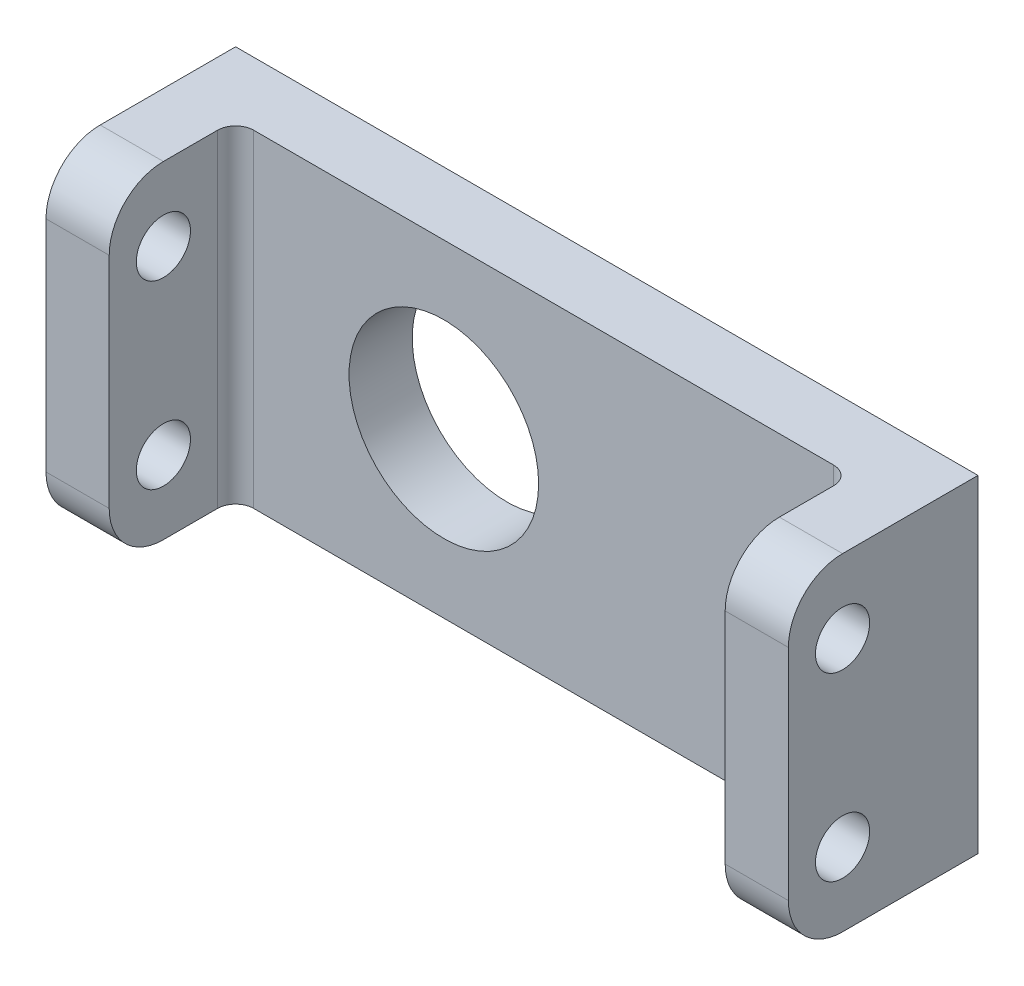
ISO-10303-21;
HEADER;
FILE_DESCRIPTION(('STEP AP214'),'2;1');
FILE_NAME('part.step','',(''),(''),'','','');
FILE_SCHEMA(('AUTOMOTIVE_DESIGN { 1 0 10303 214 1 1 1 1 }'));
ENDSEC;
DATA;
#1=APPLICATION_CONTEXT('core data for automotive mechanical design processes');
#2=APPLICATION_PROTOCOL_DEFINITION('international standard','automotive_design',2000,#1);
#3=PRODUCT_CONTEXT('',#1,'mechanical');
#4=PRODUCT('Part','Part','',(#3));
#5=PRODUCT_RELATED_PRODUCT_CATEGORY('part','',(#4));
#6=PRODUCT_DEFINITION_FORMATION('','',#4);
#7=PRODUCT_DEFINITION_CONTEXT('part definition',#1,'design');
#8=PRODUCT_DEFINITION('design','',#6,#7);
#9=PRODUCT_DEFINITION_SHAPE('','',#8);
#10=(LENGTH_UNIT() NAMED_UNIT(*) SI_UNIT(.MILLI.,.METRE.));
#11=(NAMED_UNIT(*) PLANE_ANGLE_UNIT() SI_UNIT($,.RADIAN.));
#12=(NAMED_UNIT(*) SI_UNIT($,.STERADIAN.) SOLID_ANGLE_UNIT());
#13=UNCERTAINTY_MEASURE_WITH_UNIT(LENGTH_MEASURE(1.E-05),#10,'distance_accuracy_value','');
#14=(GEOMETRIC_REPRESENTATION_CONTEXT(3) GLOBAL_UNCERTAINTY_ASSIGNED_CONTEXT((#13)) GLOBAL_UNIT_ASSIGNED_CONTEXT((#10,
#11,#12)) REPRESENTATION_CONTEXT('',''));
#15=CARTESIAN_POINT('',(0.,0.,0.));
#16=DIRECTION('',(0.,0.,1.));
#17=DIRECTION('',(1.,0.,0.));
#18=AXIS2_PLACEMENT_3D('',#15,#16,#17);
#19=CARTESIAN_POINT('',(0.,0.,3.5));
#20=DIRECTION('',(0.,0.,-1.));
#21=DIRECTION('',(-1.,0.,0.));
#22=AXIS2_PLACEMENT_3D('',#19,#20,#21);
#23=PLANE('',#22);
#24=CARTESIAN_POINT('',(-17.4839597508269,-3.012876727069,3.5));
#25=DIRECTION('',(0.,0.,1.));
#26=DIRECTION('',(1.,0.,0.));
#27=AXIS2_PLACEMENT_3D('',#24,#25,#26);
#28=CIRCLE('',#27,5.25);
#29=CARTESIAN_POINT('',(-12.2339597508269,-3.012876727069,3.5));
#30=VERTEX_POINT('',#29);
#31=EDGE_CURVE('E163',#30,#30,#28,.T.);
#32=ORIENTED_EDGE('',*,*,#31,.F.);
#33=EDGE_LOOP('',(#32));
#34=FACE_BOUND('',#33,.T.);
#35=DIRECTION('',(-1.,0.,0.));
#36=VECTOR('',#35,1.);
#37=CARTESIAN_POINT('',(8.5960402491731,6.057123272931,3.5));
#38=LINE('',#37,#36);
#39=CARTESIAN_POINT('',(4.0960402491731,6.057123272931,3.5));
#40=VERTEX_POINT('',#39);
#41=CARTESIAN_POINT('',(-28.0139597508269,6.05712327293099,3.5));
#42=VERTEX_POINT('',#41);
#43=EDGE_CURVE('E175',#40,#42,#38,.T.);
#44=ORIENTED_EDGE('',*,*,#43,.T.);
#45=DIRECTION('',(0.,1.,0.));
#46=VECTOR('',#45,1.);
#47=CARTESIAN_POINT('',(-28.0139597508269,-12.082876727069,3.5));
#48=LINE('',#47,#46);
#49=CARTESIAN_POINT('',(-28.0139597508269,-12.082876727069,3.5));
#50=VERTEX_POINT('',#49);
#51=EDGE_CURVE('E194',#42,#50,#48,.F.);
#52=ORIENTED_EDGE('',*,*,#51,.T.);
#53=DIRECTION('',(1.,0.,0.));
#54=VECTOR('',#53,1.);
#55=CARTESIAN_POINT('',(8.59604024917311,-12.082876727069,3.5));
#56=LINE('',#55,#54);
#57=CARTESIAN_POINT('',(4.0960402491731,-12.082876727069,3.5));
#58=VERTEX_POINT('',#57);
#59=EDGE_CURVE('E169',#50,#58,#56,.T.);
#60=ORIENTED_EDGE('',*,*,#59,.T.);
#61=DIRECTION('',(0.,-1.,0.));
#62=VECTOR('',#61,1.);
#63=CARTESIAN_POINT('',(4.0960402491731,6.057123272931,3.5));
#64=LINE('',#63,#62);
#65=EDGE_CURVE('E192',#58,#40,#64,.F.);
#66=ORIENTED_EDGE('',*,*,#65,.T.);
#67=EDGE_LOOP('',(#44,#52,#60,#66));
#68=FACE_BOUND('',#67,.T.);
#69=ADVANCED_FACE('F33',(#34,#68),#23,.F.);
#70=CARTESIAN_POINT('',(0.,0.,0.));
#71=DIRECTION('',(0.,0.,-1.));
#72=DIRECTION('',(-1.,0.,0.));
#73=AXIS2_PLACEMENT_3D('',#70,#71,#72);
#74=PLANE('',#73);
#75=DIRECTION('',(0.,1.,0.));
#76=VECTOR('',#75,1.);
#77=CARTESIAN_POINT('',(8.5960402491731,6.057123272931,0.));
#78=LINE('',#77,#76);
#79=CARTESIAN_POINT('',(8.59604024917311,-12.082876727069,0.));
#80=VERTEX_POINT('',#79);
#81=CARTESIAN_POINT('',(8.5960402491731,6.057123272931,0.));
#82=VERTEX_POINT('',#81);
#83=EDGE_CURVE('E155',#80,#82,#78,.T.);
#84=ORIENTED_EDGE('',*,*,#83,.F.);
#85=DIRECTION('',(1.,0.,0.));
#86=VECTOR('',#85,1.);
#87=CARTESIAN_POINT('',(8.59604024917311,-12.082876727069,0.));
#88=LINE('',#87,#86);
#89=CARTESIAN_POINT('',(-32.5139597508269,-12.082876727069,0.));
#90=VERTEX_POINT('',#89);
#91=EDGE_CURVE('E173',#90,#80,#88,.T.);
#92=ORIENTED_EDGE('',*,*,#91,.F.);
#93=DIRECTION('',(0.,-1.,0.));
#94=VECTOR('',#93,1.);
#95=CARTESIAN_POINT('',(-32.5139597508269,6.05712327293099,0.));
#96=LINE('',#95,#94);
#97=CARTESIAN_POINT('',(-32.5139597508269,6.05712327293099,0.));
#98=VERTEX_POINT('',#97);
#99=EDGE_CURVE('E157',#98,#90,#96,.T.);
#100=ORIENTED_EDGE('',*,*,#99,.F.);
#101=DIRECTION('',(-1.,0.,0.));
#102=VECTOR('',#101,1.);
#103=CARTESIAN_POINT('',(8.5960402491731,6.057123272931,0.));
#104=LINE('',#103,#102);
#105=EDGE_CURVE('E140',#82,#98,#104,.T.);
#106=ORIENTED_EDGE('',*,*,#105,.F.);
#107=EDGE_LOOP('',(#84,#92,#100,#106));
#108=FACE_BOUND('',#107,.T.);
#109=CARTESIAN_POINT('',(-17.4839597508269,-3.012876727069,0.));
#110=DIRECTION('',(0.,0.,1.));
#111=DIRECTION('',(1.,0.,0.));
#112=AXIS2_PLACEMENT_3D('',#109,#110,#111);
#113=CIRCLE('',#112,5.25);
#114=CARTESIAN_POINT('',(-12.2339597508269,-3.012876727069,0.));
#115=VERTEX_POINT('',#114);
#116=EDGE_CURVE('E166',#115,#115,#113,.T.);
#117=ORIENTED_EDGE('',*,*,#116,.T.);
#118=EDGE_LOOP('',(#117));
#119=FACE_BOUND('',#118,.T.);
#120=ADVANCED_FACE('F152',(#108,#119),#74,.T.);
#121=CARTESIAN_POINT('',(8.5960402491731,6.057123272931,3.5));
#122=DIRECTION('',(-1.,0.,0.));
#123=DIRECTION('',(0.,-1.,0.));
#124=AXIS2_PLACEMENT_3D('',#121,#122,#123);
#125=PLANE('',#124);
#126=CARTESIAN_POINT('',(8.59604024917311,1.987123272931,7.5));
#127=DIRECTION('',(-1.,0.,0.));
#128=DIRECTION('',(0.,-1.,0.));
#129=AXIS2_PLACEMENT_3D('',#126,#127,#128);
#130=CIRCLE('',#129,1.5);
#131=CARTESIAN_POINT('',(8.59604024917311,0.487123272930996,7.5));
#132=VERTEX_POINT('',#131);
#133=EDGE_CURVE('E252',#132,#132,#130,.T.);
#134=ORIENTED_EDGE('',*,*,#133,.T.);
#135=EDGE_LOOP('',(#134));
#136=FACE_BOUND('',#135,.T.);
#137=CARTESIAN_POINT('',(8.59604024917311,-8.012876727069,7.5));
#138=DIRECTION('',(-1.,0.,0.));
#139=DIRECTION('',(0.,-1.,0.));
#140=AXIS2_PLACEMENT_3D('',#137,#138,#139);
#141=CIRCLE('',#140,1.5);
#142=CARTESIAN_POINT('',(8.59604024917311,-9.512876727069,7.5));
#143=VERTEX_POINT('',#142);
#144=EDGE_CURVE('E189',#143,#143,#141,.T.);
#145=ORIENTED_EDGE('',*,*,#144,.T.);
#146=EDGE_LOOP('',(#145));
#147=FACE_BOUND('',#146,.T.);
#148=DIRECTION('',(0.,0.,-1.));
#149=VECTOR('',#148,1.);
#150=CARTESIAN_POINT('',(8.5960402491731,6.057123272931,3.5));
#151=LINE('',#150,#149);
#152=CARTESIAN_POINT('',(8.5960402491731,6.057123272931,7.5));
#153=VERTEX_POINT('',#152);
#154=EDGE_CURVE('E136',#153,#82,#151,.T.);
#155=ORIENTED_EDGE('',*,*,#154,.F.);
#156=CARTESIAN_POINT('',(8.5960402491731,3.057123272931,7.5));
#157=DIRECTION('',(-1.,0.,0.));
#158=DIRECTION('',(0.,-1.,0.));
#159=AXIS2_PLACEMENT_3D('',#156,#157,#158);
#160=CIRCLE('',#159,3.);
#161=CARTESIAN_POINT('',(8.5960402491731,3.057123272931,10.5));
#162=VERTEX_POINT('',#161);
#163=EDGE_CURVE('E11',#153,#162,#160,.F.);
#164=ORIENTED_EDGE('',*,*,#163,.T.);
#165=DIRECTION('',(0.,1.,0.));
#166=VECTOR('',#165,1.);
#167=CARTESIAN_POINT('',(8.5960402491731,6.057123272931,10.5));
#168=LINE('',#167,#166);
#169=CARTESIAN_POINT('',(8.5960402491731,-9.082876727069,10.5));
#170=VERTEX_POINT('',#169);
#171=EDGE_CURVE('E238',#170,#162,#168,.T.);
#172=ORIENTED_EDGE('',*,*,#171,.F.);
#173=CARTESIAN_POINT('',(8.59604024917311,-9.082876727069,7.5));
#174=DIRECTION('',(-1.,0.,0.));
#175=DIRECTION('',(0.,-1.,0.));
#176=AXIS2_PLACEMENT_3D('',#173,#174,#175);
#177=CIRCLE('',#176,3.);
#178=CARTESIAN_POINT('',(8.59604024917311,-12.082876727069,7.5));
#179=VERTEX_POINT('',#178);
#180=EDGE_CURVE('E41',#170,#179,#177,.F.);
#181=ORIENTED_EDGE('',*,*,#180,.T.);
#182=DIRECTION('',(0.,0.,-1.));
#183=VECTOR('',#182,1.);
#184=CARTESIAN_POINT('',(8.59604024917311,-12.082876727069,3.5));
#185=LINE('',#184,#183);
#186=EDGE_CURVE('E161',#179,#80,#185,.T.);
#187=ORIENTED_EDGE('',*,*,#186,.T.);
#188=ORIENTED_EDGE('',*,*,#83,.T.);
#189=EDGE_LOOP('',(#155,#164,#172,#181,#187,#188));
#190=FACE_BOUND('',#189,.T.);
#191=ADVANCED_FACE('F159',(#136,#147,#190),#125,.F.);
#192=CARTESIAN_POINT('',(8.5960402491731,6.057123272931,3.5));
#193=DIRECTION('',(0.,-1.,0.));
#194=DIRECTION('',(1.,0.,0.));
#195=AXIS2_PLACEMENT_3D('',#192,#193,#194);
#196=PLANE('',#195);
#197=DIRECTION('',(0.,0.,-1.));
#198=VECTOR('',#197,1.);
#199=CARTESIAN_POINT('',(-32.5139597508269,6.05712327293099,3.5));
#200=LINE('',#199,#198);
#201=CARTESIAN_POINT('',(-32.5139597508269,6.05712327293099,7.5));
#202=VERTEX_POINT('',#201);
#203=EDGE_CURVE('E148',#202,#98,#200,.T.);
#204=ORIENTED_EDGE('',*,*,#203,.F.);
#205=DIRECTION('',(-1.,0.,0.));
#206=VECTOR('',#205,1.);
#207=CARTESIAN_POINT('',(-29.0139597508269,6.05712327293099,7.5));
#208=LINE('',#207,#206);
#209=CARTESIAN_POINT('',(-29.0139597508269,6.05712327293099,7.5));
#210=VERTEX_POINT('',#209);
#211=EDGE_CURVE('E220',#202,#210,#208,.F.);
#212=ORIENTED_EDGE('',*,*,#211,.T.);
#213=DIRECTION('',(0.,0.,-1.));
#214=VECTOR('',#213,1.);
#215=CARTESIAN_POINT('',(-29.0139597508269,6.05712327293099,10.5));
#216=LINE('',#215,#214);
#217=CARTESIAN_POINT('',(-29.0139597508269,6.05712327293099,4.5));
#218=VERTEX_POINT('',#217);
#219=EDGE_CURVE('E263',#210,#218,#216,.T.);
#220=ORIENTED_EDGE('',*,*,#219,.T.);
#221=CARTESIAN_POINT('',(-28.0139597508269,6.05712327293099,4.5));
#222=DIRECTION('',(0.,-1.,0.));
#223=DIRECTION('',(1.,0.,0.));
#224=AXIS2_PLACEMENT_3D('',#221,#222,#223);
#225=CIRCLE('',#224,1.);
#226=EDGE_CURVE('E199',#218,#42,#225,.T.);
#227=ORIENTED_EDGE('',*,*,#226,.T.);
#228=ORIENTED_EDGE('',*,*,#43,.F.);
#229=CARTESIAN_POINT('',(4.0960402491731,6.057123272931,4.5));
#230=DIRECTION('',(0.,-1.,0.));
#231=DIRECTION('',(1.,0.,0.));
#232=AXIS2_PLACEMENT_3D('',#229,#230,#231);
#233=CIRCLE('',#232,1.);
#234=CARTESIAN_POINT('',(5.0960402491731,6.057123272931,4.5));
#235=VERTEX_POINT('',#234);
#236=EDGE_CURVE('E206',#40,#235,#233,.T.);
#237=ORIENTED_EDGE('',*,*,#236,.T.);
#238=DIRECTION('',(0.,0.,-1.));
#239=VECTOR('',#238,1.);
#240=CARTESIAN_POINT('',(5.0960402491731,6.057123272931,10.5));
#241=LINE('',#240,#239);
#242=CARTESIAN_POINT('',(5.0960402491731,6.057123272931,7.5));
#243=VERTEX_POINT('',#242);
#244=EDGE_CURVE('E250',#243,#235,#241,.T.);
#245=ORIENTED_EDGE('',*,*,#244,.F.);
#246=DIRECTION('',(-1.,0.,0.));
#247=VECTOR('',#246,1.);
#248=CARTESIAN_POINT('',(8.5960402491731,6.057123272931,7.5));
#249=LINE('',#248,#247);
#250=EDGE_CURVE('E143',#243,#153,#249,.F.);
#251=ORIENTED_EDGE('',*,*,#250,.T.);
#252=ORIENTED_EDGE('',*,*,#154,.T.);
#253=ORIENTED_EDGE('',*,*,#105,.T.);
#254=EDGE_LOOP('',(#204,#212,#220,#227,#228,#237,#245,#251,#252,#253));
#255=FACE_BOUND('',#254,.T.);
#256=ADVANCED_FACE('F139',(#255),#196,.F.);
#257=CARTESIAN_POINT('',(-32.5139597508269,6.05712327293099,3.5));
#258=DIRECTION('',(1.,0.,0.));
#259=DIRECTION('',(0.,0.,-1.));
#260=AXIS2_PLACEMENT_3D('',#257,#258,#259);
#261=PLANE('',#260);
#262=CARTESIAN_POINT('',(-32.5139597508269,1.98712327293099,7.5));
#263=DIRECTION('',(1.,0.,0.));
#264=DIRECTION('',(0.,1.,0.));
#265=AXIS2_PLACEMENT_3D('',#262,#263,#264);
#266=CIRCLE('',#265,1.5);
#267=CARTESIAN_POINT('',(-32.5139597508269,3.48712327293099,7.5));
#268=VERTEX_POINT('',#267);
#269=EDGE_CURVE('E184',#268,#268,#266,.T.);
#270=ORIENTED_EDGE('',*,*,#269,.T.);
#271=EDGE_LOOP('',(#270));
#272=FACE_BOUND('',#271,.T.);
#273=CARTESIAN_POINT('',(-32.5139597508269,-8.01287672706901,7.5));
#274=DIRECTION('',(1.,0.,0.));
#275=DIRECTION('',(0.,1.,0.));
#276=AXIS2_PLACEMENT_3D('',#273,#274,#275);
#277=CIRCLE('',#276,1.5);
#278=CARTESIAN_POINT('',(-32.5139597508269,-6.51287672706901,7.5));
#279=VERTEX_POINT('',#278);
#280=EDGE_CURVE('E370',#279,#279,#277,.T.);
#281=ORIENTED_EDGE('',*,*,#280,.T.);
#282=EDGE_LOOP('',(#281));
#283=FACE_BOUND('',#282,.T.);
#284=DIRECTION('',(0.,-1.,0.));
#285=VECTOR('',#284,1.);
#286=CARTESIAN_POINT('',(-32.5139597508269,6.05712327293099,10.5));
#287=LINE('',#286,#285);
#288=CARTESIAN_POINT('',(-32.5139597508269,3.05712327293099,10.5));
#289=VERTEX_POINT('',#288);
#290=CARTESIAN_POINT('',(-32.5139597508269,-9.082876727069,10.5));
#291=VERTEX_POINT('',#290);
#292=EDGE_CURVE('E257',#289,#291,#287,.T.);
#293=ORIENTED_EDGE('',*,*,#292,.F.);
#294=CARTESIAN_POINT('',(-32.5139597508269,3.05712327293099,7.5));
#295=DIRECTION('',(1.,0.,0.));
#296=DIRECTION('',(0.,0.,-1.));
#297=AXIS2_PLACEMENT_3D('',#294,#295,#296);
#298=CIRCLE('',#297,3.);
#299=EDGE_CURVE('E217',#289,#202,#298,.F.);
#300=ORIENTED_EDGE('',*,*,#299,.T.);
#301=ORIENTED_EDGE('',*,*,#203,.T.);
#302=ORIENTED_EDGE('',*,*,#99,.T.);
#303=DIRECTION('',(0.,0.,-1.));
#304=VECTOR('',#303,1.);
#305=CARTESIAN_POINT('',(-32.5139597508269,-12.082876727069,3.5));
#306=LINE('',#305,#304);
#307=CARTESIAN_POINT('',(-32.5139597508269,-12.082876727069,7.5));
#308=VERTEX_POINT('',#307);
#309=EDGE_CURVE('E177',#308,#90,#306,.T.);
#310=ORIENTED_EDGE('',*,*,#309,.F.);
#311=CARTESIAN_POINT('',(-32.5139597508269,-9.08287672706901,7.5));
#312=DIRECTION('',(1.,0.,0.));
#313=DIRECTION('',(0.,0.,-1.));
#314=AXIS2_PLACEMENT_3D('',#311,#312,#313);
#315=CIRCLE('',#314,3.);
#316=EDGE_CURVE('E215',#308,#291,#315,.F.);
#317=ORIENTED_EDGE('',*,*,#316,.T.);
#318=EDGE_LOOP('',(#293,#300,#301,#302,#310,#317));
#319=FACE_BOUND('',#318,.T.);
#320=ADVANCED_FACE('F298',(#272,#283,#319),#261,.F.);
#321=CARTESIAN_POINT('',(8.59604024917311,-12.082876727069,3.5));
#322=DIRECTION('',(0.,1.,0.));
#323=DIRECTION('',(-1.,0.,0.));
#324=AXIS2_PLACEMENT_3D('',#321,#322,#323);
#325=PLANE('',#324);
#326=DIRECTION('',(0.,0.,-1.));
#327=VECTOR('',#326,1.);
#328=CARTESIAN_POINT('',(-29.0139597508269,-12.082876727069,10.5));
#329=LINE('',#328,#327);
#330=CARTESIAN_POINT('',(-29.0139597508269,-12.082876727069,7.5));
#331=VERTEX_POINT('',#330);
#332=CARTESIAN_POINT('',(-29.0139597508269,-12.082876727069,4.5));
#333=VERTEX_POINT('',#332);
#334=EDGE_CURVE('E265',#331,#333,#329,.T.);
#335=ORIENTED_EDGE('',*,*,#334,.F.);
#336=DIRECTION('',(1.,0.,0.));
#337=VECTOR('',#336,1.);
#338=CARTESIAN_POINT('',(-32.5139597508269,-12.082876727069,7.5));
#339=LINE('',#338,#337);
#340=EDGE_CURVE('E228',#331,#308,#339,.F.);
#341=ORIENTED_EDGE('',*,*,#340,.T.);
#342=ORIENTED_EDGE('',*,*,#309,.T.);
#343=ORIENTED_EDGE('',*,*,#91,.T.);
#344=ORIENTED_EDGE('',*,*,#186,.F.);
#345=DIRECTION('',(1.,0.,0.));
#346=VECTOR('',#345,1.);
#347=CARTESIAN_POINT('',(8.59604024917311,-12.082876727069,7.5));
#348=LINE('',#347,#346);
#349=CARTESIAN_POINT('',(5.0960402491731,-12.082876727069,7.5));
#350=VERTEX_POINT('',#349);
#351=EDGE_CURVE('E226',#179,#350,#348,.F.);
#352=ORIENTED_EDGE('',*,*,#351,.T.);
#353=DIRECTION('',(0.,0.,-1.));
#354=VECTOR('',#353,1.);
#355=CARTESIAN_POINT('',(5.0960402491731,-12.082876727069,10.5));
#356=LINE('',#355,#354);
#357=CARTESIAN_POINT('',(5.0960402491731,-12.082876727069,4.5));
#358=VERTEX_POINT('',#357);
#359=EDGE_CURVE('E248',#350,#358,#356,.T.);
#360=ORIENTED_EDGE('',*,*,#359,.T.);
#361=CARTESIAN_POINT('',(4.0960402491731,-12.082876727069,4.5));
#362=DIRECTION('',(0.,1.,0.));
#363=DIRECTION('',(-1.,0.,0.));
#364=AXIS2_PLACEMENT_3D('',#361,#362,#363);
#365=CIRCLE('',#364,1.);
#366=EDGE_CURVE('E204',#358,#58,#365,.T.);
#367=ORIENTED_EDGE('',*,*,#366,.T.);
#368=ORIENTED_EDGE('',*,*,#59,.F.);
#369=CARTESIAN_POINT('',(-28.0139597508269,-12.082876727069,4.5));
#370=DIRECTION('',(0.,1.,0.));
#371=DIRECTION('',(-1.,0.,0.));
#372=AXIS2_PLACEMENT_3D('',#369,#370,#371);
#373=CIRCLE('',#372,1.);
#374=EDGE_CURVE('E201',#50,#333,#373,.T.);
#375=ORIENTED_EDGE('',*,*,#374,.T.);
#376=EDGE_LOOP('',(#335,#341,#342,#343,#344,#352,#360,#367,#368,#375));
#377=FACE_BOUND('',#376,.T.);
#378=ADVANCED_FACE('F244',(#377),#325,.F.);
#379=CARTESIAN_POINT('',(-17.4839597508269,-3.012876727069,3.5));
#380=DIRECTION('',(0.,0.,-1.));
#381=DIRECTION('',(-1.,0.,0.));
#382=AXIS2_PLACEMENT_3D('',#379,#380,#381);
#383=CYLINDRICAL_SURFACE('',#382,5.25);
#384=ORIENTED_EDGE('',*,*,#31,.T.);
#385=EDGE_LOOP('',(#384));
#386=FACE_BOUND('',#385,.T.);
#387=ORIENTED_EDGE('',*,*,#116,.F.);
#388=EDGE_LOOP('',(#387));
#389=FACE_BOUND('',#388,.T.);
#390=ADVANCED_FACE('F323',(#386,#389),#383,.F.);
#391=CARTESIAN_POINT('',(-29.0139597508269,6.05712327293099,10.5));
#392=DIRECTION('',(-1.,0.,0.));
#393=DIRECTION('',(0.,-1.,0.));
#394=AXIS2_PLACEMENT_3D('',#391,#392,#393);
#395=PLANE('',#394);
#396=CARTESIAN_POINT('',(-29.0139597508269,1.98712327293099,7.5));
#397=DIRECTION('',(-1.,0.,0.));
#398=DIRECTION('',(0.,-1.,0.));
#399=AXIS2_PLACEMENT_3D('',#396,#397,#398);
#400=CIRCLE('',#399,1.5);
#401=CARTESIAN_POINT('',(-29.0139597508269,0.487123272930989,7.5));
#402=VERTEX_POINT('',#401);
#403=EDGE_CURVE('E188',#402,#402,#400,.T.);
#404=ORIENTED_EDGE('',*,*,#403,.T.);
#405=EDGE_LOOP('',(#404));
#406=FACE_BOUND('',#405,.T.);
#407=CARTESIAN_POINT('',(-29.0139597508269,-8.01287672706901,7.5));
#408=DIRECTION('',(-1.,0.,0.));
#409=DIRECTION('',(0.,-1.,0.));
#410=AXIS2_PLACEMENT_3D('',#407,#408,#409);
#411=CIRCLE('',#410,1.5);
#412=CARTESIAN_POINT('',(-29.0139597508269,-9.51287672706901,7.5));
#413=VERTEX_POINT('',#412);
#414=EDGE_CURVE('E183',#413,#413,#411,.T.);
#415=ORIENTED_EDGE('',*,*,#414,.T.);
#416=EDGE_LOOP('',(#415));
#417=FACE_BOUND('',#416,.T.);
#418=ORIENTED_EDGE('',*,*,#219,.F.);
#419=CARTESIAN_POINT('',(-29.0139597508269,3.05712327293099,7.5));
#420=DIRECTION('',(-1.,0.,0.));
#421=DIRECTION('',(0.,-1.,0.));
#422=AXIS2_PLACEMENT_3D('',#419,#420,#421);
#423=CIRCLE('',#422,3.);
#424=CARTESIAN_POINT('',(-29.0139597508269,3.05712327293099,10.5));
#425=VERTEX_POINT('',#424);
#426=EDGE_CURVE('E224',#210,#425,#423,.F.);
#427=ORIENTED_EDGE('',*,*,#426,.T.);
#428=DIRECTION('',(0.,1.,0.));
#429=VECTOR('',#428,1.);
#430=CARTESIAN_POINT('',(-29.0139597508269,6.05712327293099,10.5));
#431=LINE('',#430,#429);
#432=CARTESIAN_POINT('',(-29.0139597508269,-9.082876727069,10.5));
#433=VERTEX_POINT('',#432);
#434=EDGE_CURVE('E260',#433,#425,#431,.T.);
#435=ORIENTED_EDGE('',*,*,#434,.F.);
#436=CARTESIAN_POINT('',(-29.0139597508269,-9.082876727069,7.5));
#437=DIRECTION('',(-1.,0.,0.));
#438=DIRECTION('',(0.,-1.,0.));
#439=AXIS2_PLACEMENT_3D('',#436,#437,#438);
#440=CIRCLE('',#439,3.);
#441=EDGE_CURVE('E222',#433,#331,#440,.F.);
#442=ORIENTED_EDGE('',*,*,#441,.T.);
#443=ORIENTED_EDGE('',*,*,#334,.T.);
#444=DIRECTION('',(0.,1.,0.));
#445=VECTOR('',#444,1.);
#446=CARTESIAN_POINT('',(-29.0139597508269,6.05712327293099,4.5));
#447=LINE('',#446,#445);
#448=EDGE_CURVE('E147',#333,#218,#447,.T.);
#449=ORIENTED_EDGE('',*,*,#448,.T.);
#450=EDGE_LOOP('',(#418,#427,#435,#442,#443,#449));
#451=FACE_BOUND('',#450,.T.);
#452=ADVANCED_FACE('F287',(#406,#417,#451),#395,.F.);
#453=CARTESIAN_POINT('',(0.,0.,10.5));
#454=DIRECTION('',(0.,0.,1.));
#455=DIRECTION('',(1.,0.,0.));
#456=AXIS2_PLACEMENT_3D('',#453,#454,#455);
#457=PLANE('',#456);
#458=ORIENTED_EDGE('',*,*,#434,.T.);
#459=DIRECTION('',(-1.,0.,0.));
#460=VECTOR('',#459,1.);
#461=CARTESIAN_POINT('',(-32.5139597508269,3.05712327293099,10.5));
#462=LINE('',#461,#460);
#463=EDGE_CURVE('E212',#425,#289,#462,.T.);
#464=ORIENTED_EDGE('',*,*,#463,.T.);
#465=ORIENTED_EDGE('',*,*,#292,.T.);
#466=DIRECTION('',(1.,0.,0.));
#467=VECTOR('',#466,1.);
#468=CARTESIAN_POINT('',(-29.0139597508269,-9.082876727069,10.5));
#469=LINE('',#468,#467);
#470=EDGE_CURVE('E209',#291,#433,#469,.T.);
#471=ORIENTED_EDGE('',*,*,#470,.T.);
#472=EDGE_LOOP('',(#458,#464,#465,#471));
#473=FACE_BOUND('',#472,.T.);
#474=ADVANCED_FACE('F300',(#473),#457,.T.);
#475=CARTESIAN_POINT('',(5.0960402491731,6.057123272931,10.5));
#476=DIRECTION('',(1.,0.,0.));
#477=DIRECTION('',(0.,1.,0.));
#478=AXIS2_PLACEMENT_3D('',#475,#476,#477);
#479=PLANE('',#478);
#480=CARTESIAN_POINT('',(5.0960402491731,1.987123272931,7.5));
#481=DIRECTION('',(1.,0.,0.));
#482=DIRECTION('',(0.,1.,0.));
#483=AXIS2_PLACEMENT_3D('',#480,#481,#482);
#484=CIRCLE('',#483,1.5);
#485=CARTESIAN_POINT('',(5.0960402491731,3.487123272931,7.5));
#486=VERTEX_POINT('',#485);
#487=EDGE_CURVE('E185',#486,#486,#484,.T.);
#488=ORIENTED_EDGE('',*,*,#487,.T.);
#489=EDGE_LOOP('',(#488));
#490=FACE_BOUND('',#489,.T.);
#491=CARTESIAN_POINT('',(5.0960402491731,-8.01287672706901,7.5));
#492=DIRECTION('',(1.,0.,0.));
#493=DIRECTION('',(0.,1.,0.));
#494=AXIS2_PLACEMENT_3D('',#491,#492,#493);
#495=CIRCLE('',#494,1.5);
#496=CARTESIAN_POINT('',(5.0960402491731,-6.51287672706901,7.5));
#497=VERTEX_POINT('',#496);
#498=EDGE_CURVE('E180',#497,#497,#495,.T.);
#499=ORIENTED_EDGE('',*,*,#498,.T.);
#500=EDGE_LOOP('',(#499));
#501=FACE_BOUND('',#500,.T.);
#502=DIRECTION('',(0.,-1.,0.));
#503=VECTOR('',#502,1.);
#504=CARTESIAN_POINT('',(5.0960402491731,6.057123272931,10.5));
#505=LINE('',#504,#503);
#506=CARTESIAN_POINT('',(5.0960402491731,3.057123272931,10.5));
#507=VERTEX_POINT('',#506);
#508=CARTESIAN_POINT('',(5.0960402491731,-9.082876727069,10.5));
#509=VERTEX_POINT('',#508);
#510=EDGE_CURVE('E247',#507,#509,#505,.T.);
#511=ORIENTED_EDGE('',*,*,#510,.F.);
#512=CARTESIAN_POINT('',(5.0960402491731,3.057123272931,7.5));
#513=DIRECTION('',(1.,0.,0.));
#514=DIRECTION('',(0.,1.,0.));
#515=AXIS2_PLACEMENT_3D('',#512,#513,#514);
#516=CIRCLE('',#515,3.);
#517=EDGE_CURVE('E56',#507,#243,#516,.F.);
#518=ORIENTED_EDGE('',*,*,#517,.T.);
#519=ORIENTED_EDGE('',*,*,#244,.T.);
#520=DIRECTION('',(0.,-1.,0.));
#521=VECTOR('',#520,1.);
#522=CARTESIAN_POINT('',(5.0960402491731,-12.082876727069,4.5));
#523=LINE('',#522,#521);
#524=EDGE_CURVE('E196',#235,#358,#523,.T.);
#525=ORIENTED_EDGE('',*,*,#524,.T.);
#526=ORIENTED_EDGE('',*,*,#359,.F.);
#527=CARTESIAN_POINT('',(5.0960402491731,-9.082876727069,7.5));
#528=DIRECTION('',(1.,0.,0.));
#529=DIRECTION('',(0.,1.,0.));
#530=AXIS2_PLACEMENT_3D('',#527,#528,#529);
#531=CIRCLE('',#530,3.);
#532=EDGE_CURVE('E48',#350,#509,#531,.F.);
#533=ORIENTED_EDGE('',*,*,#532,.T.);
#534=EDGE_LOOP('',(#511,#518,#519,#525,#526,#533));
#535=FACE_BOUND('',#534,.T.);
#536=ADVANCED_FACE('F385',(#490,#501,#535),#479,.F.);
#537=CARTESIAN_POINT('',(0.,0.,10.5));
#538=DIRECTION('',(0.,0.,-1.));
#539=DIRECTION('',(-1.,0.,0.));
#540=AXIS2_PLACEMENT_3D('',#537,#538,#539);
#541=PLANE('',#540);
#542=ORIENTED_EDGE('',*,*,#171,.T.);
#543=DIRECTION('',(-1.,0.,0.));
#544=VECTOR('',#543,1.);
#545=CARTESIAN_POINT('',(0.,3.057123272931,10.5));
#546=LINE('',#545,#544);
#547=EDGE_CURVE('E233',#162,#507,#546,.T.);
#548=ORIENTED_EDGE('',*,*,#547,.T.);
#549=ORIENTED_EDGE('',*,*,#510,.T.);
#550=DIRECTION('',(1.,0.,0.));
#551=VECTOR('',#550,1.);
#552=CARTESIAN_POINT('',(0.,-9.082876727069,10.5));
#553=LINE('',#552,#551);
#554=EDGE_CURVE('E230',#509,#170,#553,.T.);
#555=ORIENTED_EDGE('',*,*,#554,.T.);
#556=EDGE_LOOP('',(#542,#548,#549,#555));
#557=FACE_BOUND('',#556,.T.);
#558=ADVANCED_FACE('F246',(#557),#541,.F.);
#559=CARTESIAN_POINT('',(-32.5139597508269,-8.01287672706901,7.5));
#560=DIRECTION('',(1.,0.,0.));
#561=DIRECTION('',(0.,1.,0.));
#562=AXIS2_PLACEMENT_3D('',#559,#560,#561);
#563=CYLINDRICAL_SURFACE('',#562,1.5);
#564=ORIENTED_EDGE('',*,*,#498,.F.);
#565=EDGE_LOOP('',(#564));
#566=FACE_BOUND('',#565,.T.);
#567=ORIENTED_EDGE('',*,*,#144,.F.);
#568=EDGE_LOOP('',(#567));
#569=FACE_BOUND('',#568,.T.);
#570=ADVANCED_FACE('F350',(#566,#569),#563,.F.);
#571=CARTESIAN_POINT('',(-32.5139597508269,1.98712327293099,7.5));
#572=DIRECTION('',(1.,0.,0.));
#573=DIRECTION('',(0.,1.,0.));
#574=AXIS2_PLACEMENT_3D('',#571,#572,#573);
#575=CYLINDRICAL_SURFACE('',#574,1.5);
#576=ORIENTED_EDGE('',*,*,#487,.F.);
#577=EDGE_LOOP('',(#576));
#578=FACE_BOUND('',#577,.T.);
#579=ORIENTED_EDGE('',*,*,#133,.F.);
#580=EDGE_LOOP('',(#579));
#581=FACE_BOUND('',#580,.T.);
#582=ADVANCED_FACE('F344',(#578,#581),#575,.F.);
#583=ORIENTED_EDGE('',*,*,#280,.F.);
#584=EDGE_LOOP('',(#583));
#585=FACE_BOUND('',#584,.T.);
#586=ORIENTED_EDGE('',*,*,#414,.F.);
#587=EDGE_LOOP('',(#586));
#588=FACE_BOUND('',#587,.T.);
#589=ADVANCED_FACE('F341',(#585,#588),#563,.F.);
#590=ORIENTED_EDGE('',*,*,#269,.F.);
#591=EDGE_LOOP('',(#590));
#592=FACE_BOUND('',#591,.T.);
#593=ORIENTED_EDGE('',*,*,#403,.F.);
#594=EDGE_LOOP('',(#593));
#595=FACE_BOUND('',#594,.T.);
#596=ADVANCED_FACE('F337',(#592,#595),#575,.F.);
#597=CARTESIAN_POINT('',(-28.0139597508269,6.05712327293099,4.5));
#598=DIRECTION('',(0.,-1.,0.));
#599=DIRECTION('',(1.,0.,0.));
#600=AXIS2_PLACEMENT_3D('',#597,#598,#599);
#601=CYLINDRICAL_SURFACE('',#600,1.);
#602=ORIENTED_EDGE('',*,*,#374,.F.);
#603=ORIENTED_EDGE('',*,*,#51,.F.);
#604=ORIENTED_EDGE('',*,*,#226,.F.);
#605=ORIENTED_EDGE('',*,*,#448,.F.);
#606=EDGE_LOOP('',(#602,#603,#604,#605));
#607=FACE_BOUND('',#606,.T.);
#608=ADVANCED_FACE('F285',(#607),#601,.F.);
#609=CARTESIAN_POINT('',(4.0960402491731,6.057123272931,4.5));
#610=DIRECTION('',(0.,1.,0.));
#611=DIRECTION('',(-1.,0.,0.));
#612=AXIS2_PLACEMENT_3D('',#609,#610,#611);
#613=CYLINDRICAL_SURFACE('',#612,1.);
#614=ORIENTED_EDGE('',*,*,#236,.F.);
#615=ORIENTED_EDGE('',*,*,#65,.F.);
#616=ORIENTED_EDGE('',*,*,#366,.F.);
#617=ORIENTED_EDGE('',*,*,#524,.F.);
#618=EDGE_LOOP('',(#614,#615,#616,#617));
#619=FACE_BOUND('',#618,.T.);
#620=ADVANCED_FACE('F279',(#619),#613,.F.);
#621=CARTESIAN_POINT('',(0.,3.057123272931,7.5));
#622=DIRECTION('',(1.,0.,0.));
#623=DIRECTION('',(0.,1.,0.));
#624=AXIS2_PLACEMENT_3D('',#621,#622,#623);
#625=CYLINDRICAL_SURFACE('',#624,3.);
#626=ORIENTED_EDGE('',*,*,#426,.F.);
#627=ORIENTED_EDGE('',*,*,#211,.F.);
#628=ORIENTED_EDGE('',*,*,#299,.F.);
#629=ORIENTED_EDGE('',*,*,#463,.F.);
#630=EDGE_LOOP('',(#626,#627,#628,#629));
#631=FACE_BOUND('',#630,.T.);
#632=ADVANCED_FACE('F303',(#631),#625,.T.);
#633=CARTESIAN_POINT('',(0.,-9.082876727069,7.5));
#634=DIRECTION('',(-1.,0.,0.));
#635=DIRECTION('',(0.,-1.,0.));
#636=AXIS2_PLACEMENT_3D('',#633,#634,#635);
#637=CYLINDRICAL_SURFACE('',#636,3.);
#638=ORIENTED_EDGE('',*,*,#316,.F.);
#639=ORIENTED_EDGE('',*,*,#340,.F.);
#640=ORIENTED_EDGE('',*,*,#441,.F.);
#641=ORIENTED_EDGE('',*,*,#470,.F.);
#642=EDGE_LOOP('',(#638,#639,#640,#641));
#643=FACE_BOUND('',#642,.T.);
#644=ADVANCED_FACE('F294',(#643),#637,.T.);
#645=CARTESIAN_POINT('',(0.,3.057123272931,7.5));
#646=DIRECTION('',(-1.,0.,0.));
#647=DIRECTION('',(0.,-1.,0.));
#648=AXIS2_PLACEMENT_3D('',#645,#646,#647);
#649=CYLINDRICAL_SURFACE('',#648,3.);
#650=ORIENTED_EDGE('',*,*,#163,.F.);
#651=ORIENTED_EDGE('',*,*,#250,.F.);
#652=ORIENTED_EDGE('',*,*,#517,.F.);
#653=ORIENTED_EDGE('',*,*,#547,.F.);
#654=EDGE_LOOP('',(#650,#651,#652,#653));
#655=FACE_BOUND('',#654,.T.);
#656=ADVANCED_FACE('F311',(#655),#649,.T.);
#657=CARTESIAN_POINT('',(0.,-9.082876727069,7.5));
#658=DIRECTION('',(1.,0.,0.));
#659=DIRECTION('',(0.,1.,0.));
#660=AXIS2_PLACEMENT_3D('',#657,#658,#659);
#661=CYLINDRICAL_SURFACE('',#660,3.);
#662=ORIENTED_EDGE('',*,*,#532,.F.);
#663=ORIENTED_EDGE('',*,*,#351,.F.);
#664=ORIENTED_EDGE('',*,*,#180,.F.);
#665=ORIENTED_EDGE('',*,*,#554,.F.);
#666=EDGE_LOOP('',(#662,#663,#664,#665));
#667=FACE_BOUND('',#666,.T.);
#668=ADVANCED_FACE('F35',(#667),#661,.T.);
#669=CLOSED_SHELL('',(#69,#120,#191,#256,#320,#378,#390,#452,#474,#536,#558,#570,#582,#589,#596,
#608,#620,#632,#644,#656,#668));
#670=MANIFOLD_SOLID_BREP('B2',#669);
#671=ADVANCED_BREP_SHAPE_REPRESENTATION('',(#18,#670),#14);
#672=SHAPE_DEFINITION_REPRESENTATION(#9,#671);
ENDSEC;
END-ISO-10303-21;
